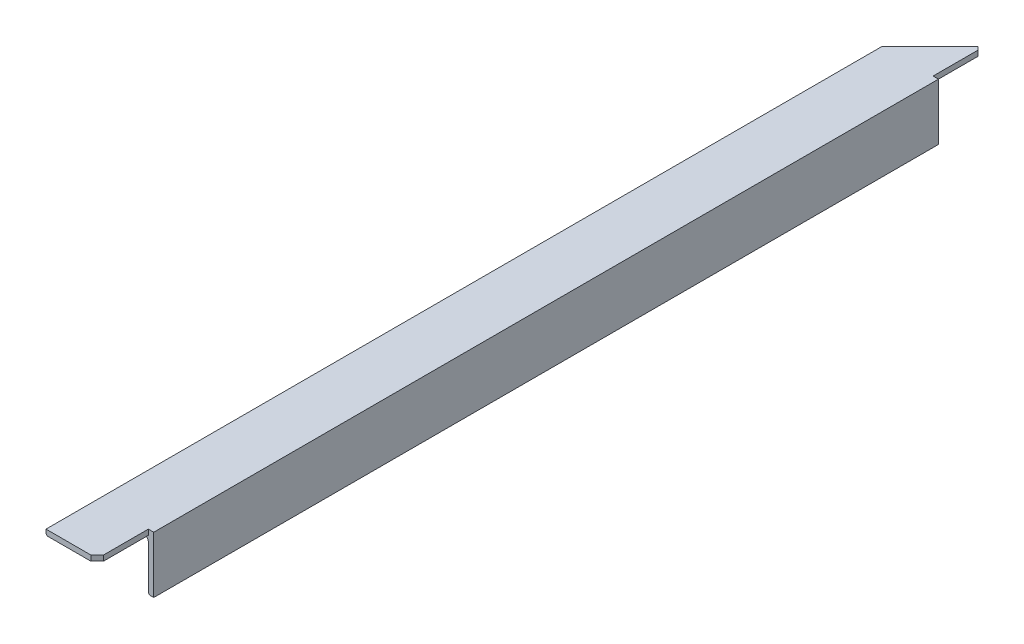
ISO-10303-21;
HEADER;
FILE_DESCRIPTION(('STEP AP214'),'2;1');
FILE_NAME('part.step','',(''),(''),'','','');
FILE_SCHEMA(('AUTOMOTIVE_DESIGN { 1 0 10303 214 1 1 1 1 }'));
ENDSEC;
DATA;
#1=APPLICATION_CONTEXT('core data for automotive mechanical design processes');
#2=APPLICATION_PROTOCOL_DEFINITION('international standard','automotive_design',2000,#1);
#3=PRODUCT_CONTEXT('',#1,'mechanical');
#4=PRODUCT('Part','Part','',(#3));
#5=PRODUCT_RELATED_PRODUCT_CATEGORY('part','',(#4));
#6=PRODUCT_DEFINITION_FORMATION('','',#4);
#7=PRODUCT_DEFINITION_CONTEXT('part definition',#1,'design');
#8=PRODUCT_DEFINITION('design','',#6,#7);
#9=PRODUCT_DEFINITION_SHAPE('','',#8);
#10=(LENGTH_UNIT() NAMED_UNIT(*) SI_UNIT(.MILLI.,.METRE.));
#11=(NAMED_UNIT(*) PLANE_ANGLE_UNIT() SI_UNIT($,.RADIAN.));
#12=(NAMED_UNIT(*) SI_UNIT($,.STERADIAN.) SOLID_ANGLE_UNIT());
#13=UNCERTAINTY_MEASURE_WITH_UNIT(LENGTH_MEASURE(1.E-05),#10,'distance_accuracy_value','');
#14=(GEOMETRIC_REPRESENTATION_CONTEXT(3) GLOBAL_UNCERTAINTY_ASSIGNED_CONTEXT((#13)) GLOBAL_UNIT_ASSIGNED_CONTEXT((#10,
#11,#12)) REPRESENTATION_CONTEXT('',''));
#15=CARTESIAN_POINT('',(0.,0.,0.));
#16=DIRECTION('',(0.,0.,1.));
#17=DIRECTION('',(1.,0.,0.));
#18=AXIS2_PLACEMENT_3D('',#15,#16,#17);
#19=CARTESIAN_POINT('',(737.,1087.,500.));
#20=DIRECTION('',(0.,0.,-1.));
#21=DIRECTION('',(-1.,0.,0.));
#22=AXIS2_PLACEMENT_3D('',#19,#20,#21);
#23=CYLINDRICAL_SURFACE('',#22,7.00000000000001);
#24=CARTESIAN_POINT('',(737.,1087.,437.));
#25=DIRECTION('',(0.,0.,1.));
#26=DIRECTION('',(1.,0.,0.));
#27=AXIS2_PLACEMENT_3D('',#24,#25,#26);
#28=CIRCLE('',#27,7.00000000000001);
#29=CARTESIAN_POINT('',(737.,1094.,437.));
#30=VERTEX_POINT('',#29);
#31=CARTESIAN_POINT('',(744.000000000001,1087.,437.));
#32=VERTEX_POINT('',#31);
#33=EDGE_CURVE('E160',#30,#32,#28,.F.);
#34=ORIENTED_EDGE('',*,*,#33,.F.);
#35=DIRECTION('',(0.,0.,-1.));
#36=VECTOR('',#35,1.);
#37=CARTESIAN_POINT('',(737.,1094.,500.));
#38=LINE('',#37,#36);
#39=CARTESIAN_POINT('',(737.,1094.,-437.));
#40=VERTEX_POINT('',#39);
#41=EDGE_CURVE('E154',#30,#40,#38,.T.);
#42=ORIENTED_EDGE('',*,*,#41,.T.);
#43=CARTESIAN_POINT('',(737.,1087.,-437.));
#44=DIRECTION('',(0.,0.,1.));
#45=DIRECTION('',(1.,0.,0.));
#46=AXIS2_PLACEMENT_3D('',#43,#44,#45);
#47=CIRCLE('',#46,7.00000000000001);
#48=CARTESIAN_POINT('',(744.,1087.,-437.));
#49=VERTEX_POINT('',#48);
#50=EDGE_CURVE('E449',#49,#40,#47,.T.);
#51=ORIENTED_EDGE('',*,*,#50,.F.);
#52=DIRECTION('',(0.,0.,-1.));
#53=VECTOR('',#52,1.);
#54=CARTESIAN_POINT('',(744.,1087.,500.));
#55=LINE('',#54,#53);
#56=EDGE_CURVE('E172',#32,#49,#55,.T.);
#57=ORIENTED_EDGE('',*,*,#56,.F.);
#58=EDGE_LOOP('',(#34,#42,#51,#57));
#59=FACE_BOUND('',#58,.T.);
#60=ADVANCED_FACE('F35',(#59),#23,.F.);
#61=CARTESIAN_POINT('',(750.,1100.,-500.));
#62=DIRECTION('',(-0.707106781186547,0.,-0.707106781186548));
#63=DIRECTION('',(-0.707106781186548,0.,0.707106781186547));
#64=AXIS2_PLACEMENT_3D('',#61,#62,#63);
#65=PLANE('',#64);
#66=DIRECTION('',(0.,1.,0.));
#67=VECTOR('',#66,1.);
#68=CARTESIAN_POINT('',(740.5,1100.,-490.5));
#69=LINE('',#68,#67);
#70=CARTESIAN_POINT('',(740.5,1094.,-490.5));
#71=VERTEX_POINT('',#70);
#72=CARTESIAN_POINT('',(740.5,1100.,-490.5));
#73=VERTEX_POINT('',#72);
#74=EDGE_CURVE('E11',#71,#73,#69,.T.);
#75=ORIENTED_EDGE('',*,*,#74,.F.);
#76=DIRECTION('',(-0.707106781186548,0.,0.707106781186547));
#77=VECTOR('',#76,1.);
#78=CARTESIAN_POINT('',(243.5,1094.,6.49999999999962));
#79=LINE('',#78,#77);
#80=CARTESIAN_POINT('',(689.3,1094.,-439.3));
#81=VERTEX_POINT('',#80);
#82=EDGE_CURVE('E50',#71,#81,#79,.T.);
#83=ORIENTED_EDGE('',*,*,#82,.T.);
#84=CARTESIAN_POINT('',(689.3,1096.3,-439.3));
#85=DIRECTION('',(-0.707106781186547,0.,-0.707106781186548));
#86=DIRECTION('',(0.707106781186548,0.,-0.707106781186547));
#87=AXIS2_PLACEMENT_3D('',#84,#85,#86);
#88=ELLIPSE('',#87,3.25269119345807,2.29999999999997);
#89=CARTESIAN_POINT('',(687.,1096.3,-437.));
#90=VERTEX_POINT('',#89);
#91=EDGE_CURVE('E218',#81,#90,#88,.T.);
#92=ORIENTED_EDGE('',*,*,#91,.T.);
#93=DIRECTION('',(0.,1.,0.));
#94=VECTOR('',#93,1.);
#95=CARTESIAN_POINT('',(687.,1096.3,-437.));
#96=LINE('',#95,#94);
#97=CARTESIAN_POINT('',(687.,1100.,-437.));
#98=VERTEX_POINT('',#97);
#99=EDGE_CURVE('E236',#90,#98,#96,.T.);
#100=ORIENTED_EDGE('',*,*,#99,.T.);
#101=DIRECTION('',(0.707106781186548,0.,-0.707106781186547));
#102=VECTOR('',#101,1.);
#103=CARTESIAN_POINT('',(250.,1100.,-3.33066907387547E-13));
#104=LINE('',#103,#102);
#105=EDGE_CURVE('E43',#98,#73,#104,.T.);
#106=ORIENTED_EDGE('',*,*,#105,.T.);
#107=EDGE_LOOP('',(#75,#83,#92,#100,#106));
#108=FACE_BOUND('',#107,.T.);
#109=ADVANCED_FACE('F37',(#108),#65,.T.);
#110=CARTESIAN_POINT('',(744.,1100.,-439.3));
#111=DIRECTION('',(1.,0.,0.));
#112=DIRECTION('',(0.,0.,-1.));
#113=AXIS2_PLACEMENT_3D('',#110,#111,#112);
#114=PLANE('',#113);
#115=DIRECTION('',(0.,-1.,0.));
#116=VECTOR('',#115,1.);
#117=CARTESIAN_POINT('',(744.,1100.,-437.));
#118=LINE('',#117,#116);
#119=CARTESIAN_POINT('',(744.,1100.,-437.));
#120=VERTEX_POINT('',#119);
#121=CARTESIAN_POINT('',(744.,1094.,-437.));
#122=VERTEX_POINT('',#121);
#123=EDGE_CURVE('E252',#120,#122,#118,.T.);
#124=ORIENTED_EDGE('',*,*,#123,.T.);
#125=DIRECTION('',(0.,0.,1.));
#126=VECTOR('',#125,1.);
#127=CARTESIAN_POINT('',(743.999999999999,1094.,-510.001000000016));
#128=LINE('',#127,#126);
#129=CARTESIAN_POINT('',(744.,1094.,-487.));
#130=VERTEX_POINT('',#129);
#131=EDGE_CURVE('E446',#130,#122,#128,.T.);
#132=ORIENTED_EDGE('',*,*,#131,.F.);
#133=DIRECTION('',(0.,-1.,0.));
#134=VECTOR('',#133,1.);
#135=CARTESIAN_POINT('',(744.,1100.,-487.));
#136=LINE('',#135,#134);
#137=CARTESIAN_POINT('',(744.,1100.,-487.));
#138=VERTEX_POINT('',#137);
#139=EDGE_CURVE('E255',#138,#130,#136,.T.);
#140=ORIENTED_EDGE('',*,*,#139,.F.);
#141=DIRECTION('',(0.,0.,1.));
#142=VECTOR('',#141,1.);
#143=CARTESIAN_POINT('',(744.000000000008,1100.,500.));
#144=LINE('',#143,#142);
#145=EDGE_CURVE('E200',#138,#120,#144,.T.);
#146=ORIENTED_EDGE('',*,*,#145,.T.);
#147=EDGE_LOOP('',(#124,#132,#140,#146));
#148=FACE_BOUND('',#147,.T.);
#149=ADVANCED_FACE('F308',(#148),#114,.T.);
#150=CARTESIAN_POINT('',(744.,1100.,-487.));
#151=DIRECTION('',(-0.707106781186547,0.,0.707106781186548));
#152=DIRECTION('',(0.707106781186548,0.,0.707106781186547));
#153=AXIS2_PLACEMENT_3D('',#150,#151,#152);
#154=PLANE('',#153);
#155=DIRECTION('',(-0.707106781186548,0.,-0.707106781186547));
#156=VECTOR('',#155,1.);
#157=CARTESIAN_POINT('',(732.499499999992,1094.,-498.500500000008));
#158=LINE('',#157,#156);
#159=EDGE_CURVE('E256',#130,#71,#158,.T.);
#160=ORIENTED_EDGE('',*,*,#159,.T.);
#161=ORIENTED_EDGE('',*,*,#74,.T.);
#162=DIRECTION('',(-0.707106781186548,0.,-0.707106781186547));
#163=VECTOR('',#162,1.);
#164=CARTESIAN_POINT('',(1240.5,1100.,9.49999999999967));
#165=LINE('',#164,#163);
#166=EDGE_CURVE('E262',#138,#73,#165,.T.);
#167=ORIENTED_EDGE('',*,*,#166,.F.);
#168=ORIENTED_EDGE('',*,*,#139,.T.);
#169=EDGE_LOOP('',(#160,#161,#167,#168));
#170=FACE_BOUND('',#169,.T.);
#171=ADVANCED_FACE('F291',(#170),#154,.F.);
#172=CARTESIAN_POINT('',(750.000000000001,1037.,500.));
#173=DIRECTION('',(0.,1.,0.));
#174=DIRECTION('',(-1.,0.,0.));
#175=AXIS2_PLACEMENT_3D('',#172,#173,#174);
#176=PLANE('',#175);
#177=DIRECTION('',(-1.,0.,0.));
#178=VECTOR('',#177,1.);
#179=CARTESIAN_POINT('',(749.99999999999,1037.,-437.));
#180=LINE('',#179,#178);
#181=CARTESIAN_POINT('',(750.,1037.,-437.));
#182=VERTEX_POINT('',#181);
#183=CARTESIAN_POINT('',(746.300000000001,1037.,-437.));
#184=VERTEX_POINT('',#183);
#185=EDGE_CURVE('E212',#182,#184,#180,.T.);
#186=ORIENTED_EDGE('',*,*,#185,.F.);
#187=DIRECTION('',(0.,0.,-1.));
#188=VECTOR('',#187,1.);
#189=CARTESIAN_POINT('',(750.000000000001,1037.,500.));
#190=LINE('',#189,#188);
#191=CARTESIAN_POINT('',(750.000000000001,1037.,437.));
#192=VERTEX_POINT('',#191);
#193=EDGE_CURVE('E196',#192,#182,#190,.T.);
#194=ORIENTED_EDGE('',*,*,#193,.F.);
#195=DIRECTION('',(1.,0.,0.));
#196=VECTOR('',#195,1.);
#197=CARTESIAN_POINT('',(750.000000000001,1037.,437.));
#198=LINE('',#197,#196);
#199=CARTESIAN_POINT('',(746.300000000001,1037.,437.));
#200=VERTEX_POINT('',#199);
#201=EDGE_CURVE('E217',#200,#192,#198,.T.);
#202=ORIENTED_EDGE('',*,*,#201,.F.);
#203=DIRECTION('',(0.,0.,-1.));
#204=VECTOR('',#203,1.);
#205=CARTESIAN_POINT('',(746.300000000001,1037.,500.));
#206=LINE('',#205,#204);
#207=EDGE_CURVE('E198',#200,#184,#206,.T.);
#208=ORIENTED_EDGE('',*,*,#207,.T.);
#209=EDGE_LOOP('',(#186,#194,#202,#208));
#210=FACE_BOUND('',#209,.T.);
#211=ADVANCED_FACE('F268',(#210),#176,.F.);
#212=CARTESIAN_POINT('',(750.000000000001,1037.,500.));
#213=DIRECTION('',(-1.,0.,0.));
#214=DIRECTION('',(0.,-1.,0.));
#215=AXIS2_PLACEMENT_3D('',#212,#213,#214);
#216=PLANE('',#215);
#217=DIRECTION('',(0.,-1.,0.));
#218=VECTOR('',#217,1.);
#219=CARTESIAN_POINT('',(750.,1100.,-437.));
#220=LINE('',#219,#218);
#221=CARTESIAN_POINT('',(750.,1100.,-437.));
#222=VERTEX_POINT('',#221);
#223=EDGE_CURVE('E253',#222,#182,#220,.T.);
#224=ORIENTED_EDGE('',*,*,#223,.F.);
#225=DIRECTION('',(0.,0.,-1.));
#226=VECTOR('',#225,1.);
#227=CARTESIAN_POINT('',(750.,1100.,500.));
#228=LINE('',#227,#226);
#229=CARTESIAN_POINT('',(750.000000000001,1100.,437.));
#230=VERTEX_POINT('',#229);
#231=EDGE_CURVE('E192',#230,#222,#228,.T.);
#232=ORIENTED_EDGE('',*,*,#231,.F.);
#233=DIRECTION('',(0.,1.,0.));
#234=VECTOR('',#233,1.);
#235=CARTESIAN_POINT('',(750.,0.,437.));
#236=LINE('',#235,#234);
#237=EDGE_CURVE('E59',#192,#230,#236,.T.);
#238=ORIENTED_EDGE('',*,*,#237,.F.);
#239=ORIENTED_EDGE('',*,*,#193,.T.);
#240=EDGE_LOOP('',(#224,#232,#238,#239));
#241=FACE_BOUND('',#240,.T.);
#242=ADVANCED_FACE('F270',(#241),#216,.F.);
#243=CARTESIAN_POINT('',(744.000000000001,1039.3,500.));
#244=DIRECTION('',(1.,0.,0.));
#245=DIRECTION('',(0.,1.,0.));
#246=AXIS2_PLACEMENT_3D('',#243,#244,#245);
#247=PLANE('',#246);
#248=CARTESIAN_POINT('',(744.,1039.3,-437.));
#249=VERTEX_POINT('',#248);
#250=EDGE_CURVE('E249',#49,#249,#118,.T.);
#251=ORIENTED_EDGE('',*,*,#250,.T.);
#252=DIRECTION('',(0.,0.,-1.));
#253=VECTOR('',#252,1.);
#254=CARTESIAN_POINT('',(744.000000000001,1039.3,500.));
#255=LINE('',#254,#253);
#256=CARTESIAN_POINT('',(744.000000000001,1039.3,437.));
#257=VERTEX_POINT('',#256);
#258=EDGE_CURVE('E178',#257,#249,#255,.T.);
#259=ORIENTED_EDGE('',*,*,#258,.F.);
#260=DIRECTION('',(0.,1.,0.));
#261=VECTOR('',#260,1.);
#262=CARTESIAN_POINT('',(744.,0.,437.));
#263=LINE('',#262,#261);
#264=EDGE_CURVE('E88',#257,#32,#263,.T.);
#265=ORIENTED_EDGE('',*,*,#264,.T.);
#266=ORIENTED_EDGE('',*,*,#56,.T.);
#267=EDGE_LOOP('',(#251,#259,#265,#266));
#268=FACE_BOUND('',#267,.T.);
#269=ADVANCED_FACE('F247',(#268),#247,.F.);
#270=CARTESIAN_POINT('',(746.300000000001,1039.3,500.));
#271=DIRECTION('',(0.,0.,-1.));
#272=DIRECTION('',(-1.,0.,0.));
#273=AXIS2_PLACEMENT_3D('',#270,#271,#272);
#274=CYLINDRICAL_SURFACE('',#273,2.3);
#275=CARTESIAN_POINT('',(746.3,1039.3,-437.));
#276=DIRECTION('',(0.,0.,-1.));
#277=DIRECTION('',(-1.,0.,0.));
#278=AXIS2_PLACEMENT_3D('',#275,#276,#277);
#279=CIRCLE('',#278,2.3);
#280=EDGE_CURVE('E245',#184,#249,#279,.T.);
#281=ORIENTED_EDGE('',*,*,#280,.F.);
#282=ORIENTED_EDGE('',*,*,#207,.F.);
#283=CARTESIAN_POINT('',(746.300000000001,1039.3,437.));
#284=DIRECTION('',(0.,0.,1.));
#285=DIRECTION('',(1.,0.,0.));
#286=AXIS2_PLACEMENT_3D('',#283,#284,#285);
#287=CIRCLE('',#286,2.3);
#288=EDGE_CURVE('E167',#257,#200,#287,.T.);
#289=ORIENTED_EDGE('',*,*,#288,.F.);
#290=ORIENTED_EDGE('',*,*,#258,.T.);
#291=EDGE_LOOP('',(#281,#282,#289,#290));
#292=FACE_BOUND('',#291,.T.);
#293=ADVANCED_FACE('F244',(#292),#274,.T.);
#294=CARTESIAN_POINT('',(750.,1100.,500.));
#295=DIRECTION('',(0.,-1.,0.));
#296=DIRECTION('',(1.,0.,0.));
#297=AXIS2_PLACEMENT_3D('',#294,#295,#296);
#298=PLANE('',#297);
#299=ORIENTED_EDGE('',*,*,#145,.F.);
#300=ORIENTED_EDGE('',*,*,#166,.T.);
#301=ORIENTED_EDGE('',*,*,#105,.F.);
#302=DIRECTION('',(0.,0.,-1.));
#303=VECTOR('',#302,1.);
#304=CARTESIAN_POINT('',(687.,1100.,500.));
#305=LINE('',#304,#303);
#306=CARTESIAN_POINT('',(687.,1100.,494.));
#307=VERTEX_POINT('',#306);
#308=EDGE_CURVE('E185',#307,#98,#305,.T.);
#309=ORIENTED_EDGE('',*,*,#308,.F.);
#310=DIRECTION('',(-1.,0.,0.));
#311=VECTOR('',#310,1.);
#312=CARTESIAN_POINT('',(750.,1100.,494.));
#313=LINE('',#312,#311);
#314=CARTESIAN_POINT('',(737.,1100.,494.));
#315=VERTEX_POINT('',#314);
#316=EDGE_CURVE('E232',#315,#307,#313,.T.);
#317=ORIENTED_EDGE('',*,*,#316,.F.);
#318=DIRECTION('',(0.707106781186548,0.,-0.707106781186547));
#319=VECTOR('',#318,1.);
#320=CARTESIAN_POINT('',(740.5,1100.,490.5));
#321=LINE('',#320,#319);
#322=CARTESIAN_POINT('',(744.,1100.,487.));
#323=VERTEX_POINT('',#322);
#324=EDGE_CURVE('E195',#315,#323,#321,.T.);
#325=ORIENTED_EDGE('',*,*,#324,.T.);
#326=DIRECTION('',(0.,0.,1.));
#327=VECTOR('',#326,1.);
#328=CARTESIAN_POINT('',(744.,1100.,500.));
#329=LINE('',#328,#327);
#330=CARTESIAN_POINT('',(744.000000000001,1100.,437.));
#331=VERTEX_POINT('',#330);
#332=EDGE_CURVE('E165',#331,#323,#329,.T.);
#333=ORIENTED_EDGE('',*,*,#332,.F.);
#334=DIRECTION('',(-1.,0.,0.));
#335=VECTOR('',#334,1.);
#336=CARTESIAN_POINT('',(750.000000000001,1100.,437.));
#337=LINE('',#336,#335);
#338=EDGE_CURVE('E163',#230,#331,#337,.T.);
#339=ORIENTED_EDGE('',*,*,#338,.F.);
#340=ORIENTED_EDGE('',*,*,#231,.T.);
#341=DIRECTION('',(1.,0.,0.));
#342=VECTOR('',#341,1.);
#343=CARTESIAN_POINT('',(749.999999999989,1100.,-437.));
#344=LINE('',#343,#342);
#345=EDGE_CURVE('E205',#120,#222,#344,.T.);
#346=ORIENTED_EDGE('',*,*,#345,.F.);
#347=EDGE_LOOP('',(#299,#300,#301,#309,#317,#325,#333,#339,#340,#346));
#348=FACE_BOUND('',#347,.T.);
#349=ADVANCED_FACE('F274',(#348),#298,.F.);
#350=CARTESIAN_POINT('',(687.,1096.3,500.));
#351=DIRECTION('',(1.,0.,0.));
#352=DIRECTION('',(0.,1.,0.));
#353=AXIS2_PLACEMENT_3D('',#350,#351,#352);
#354=PLANE('',#353);
#355=ORIENTED_EDGE('',*,*,#99,.F.);
#356=DIRECTION('',(0.,0.,-1.));
#357=VECTOR('',#356,1.);
#358=CARTESIAN_POINT('',(687.,1096.3,500.));
#359=LINE('',#358,#357);
#360=CARTESIAN_POINT('',(687.,1096.3,494.));
#361=VERTEX_POINT('',#360);
#362=EDGE_CURVE('E180',#361,#90,#359,.T.);
#363=ORIENTED_EDGE('',*,*,#362,.F.);
#364=DIRECTION('',(0.,1.,0.));
#365=VECTOR('',#364,1.);
#366=CARTESIAN_POINT('',(687.,0.,494.));
#367=LINE('',#366,#365);
#368=EDGE_CURVE('E191',#361,#307,#367,.T.);
#369=ORIENTED_EDGE('',*,*,#368,.T.);
#370=ORIENTED_EDGE('',*,*,#308,.T.);
#371=EDGE_LOOP('',(#355,#363,#369,#370));
#372=FACE_BOUND('',#371,.T.);
#373=ADVANCED_FACE('F293',(#372),#354,.F.);
#374=CARTESIAN_POINT('',(689.3,1096.3,500.));
#375=DIRECTION('',(0.,0.,-1.));
#376=DIRECTION('',(-1.,0.,0.));
#377=AXIS2_PLACEMENT_3D('',#374,#375,#376);
#378=CYLINDRICAL_SURFACE('',#377,2.29999999999997);
#379=ORIENTED_EDGE('',*,*,#91,.F.);
#380=DIRECTION('',(0.,0.,-1.));
#381=VECTOR('',#380,1.);
#382=CARTESIAN_POINT('',(689.3,1094.,500.));
#383=LINE('',#382,#381);
#384=CARTESIAN_POINT('',(689.3,1094.,494.));
#385=VERTEX_POINT('',#384);
#386=EDGE_CURVE('E173',#385,#81,#383,.T.);
#387=ORIENTED_EDGE('',*,*,#386,.F.);
#388=CARTESIAN_POINT('',(689.3,1096.3,494.));
#389=DIRECTION('',(0.,0.,1.));
#390=DIRECTION('',(1.,0.,0.));
#391=AXIS2_PLACEMENT_3D('',#388,#389,#390);
#392=CIRCLE('',#391,2.29999999999997);
#393=EDGE_CURVE('E230',#361,#385,#392,.T.);
#394=ORIENTED_EDGE('',*,*,#393,.F.);
#395=ORIENTED_EDGE('',*,*,#362,.T.);
#396=EDGE_LOOP('',(#379,#387,#394,#395));
#397=FACE_BOUND('',#396,.T.);
#398=ADVANCED_FACE('F286',(#397),#378,.T.);
#399=CARTESIAN_POINT('',(737.,1094.,500.));
#400=DIRECTION('',(0.,1.,0.));
#401=DIRECTION('',(-1.,0.,0.));
#402=AXIS2_PLACEMENT_3D('',#399,#400,#401);
#403=PLANE('',#402);
#404=ORIENTED_EDGE('',*,*,#82,.F.);
#405=ORIENTED_EDGE('',*,*,#159,.F.);
#406=ORIENTED_EDGE('',*,*,#131,.T.);
#407=DIRECTION('',(1.,0.,0.));
#408=VECTOR('',#407,1.);
#409=CARTESIAN_POINT('',(744.,1094.,-437.));
#410=LINE('',#409,#408);
#411=EDGE_CURVE('E448',#40,#122,#410,.T.);
#412=ORIENTED_EDGE('',*,*,#411,.F.);
#413=ORIENTED_EDGE('',*,*,#41,.F.);
#414=DIRECTION('',(-1.,0.,0.));
#415=VECTOR('',#414,1.);
#416=CARTESIAN_POINT('',(744.,1094.,437.));
#417=LINE('',#416,#415);
#418=CARTESIAN_POINT('',(744.,1094.,437.));
#419=VERTEX_POINT('',#418);
#420=EDGE_CURVE('E149',#419,#30,#417,.T.);
#421=ORIENTED_EDGE('',*,*,#420,.F.);
#422=DIRECTION('',(0.,0.,1.));
#423=VECTOR('',#422,1.);
#424=CARTESIAN_POINT('',(744.,1094.,437.));
#425=LINE('',#424,#423);
#426=CARTESIAN_POINT('',(744.,1094.,487.));
#427=VERTEX_POINT('',#426);
#428=EDGE_CURVE('E151',#419,#427,#425,.T.);
#429=ORIENTED_EDGE('',*,*,#428,.T.);
#430=DIRECTION('',(0.707106781186548,0.,-0.707106781186547));
#431=VECTOR('',#430,1.);
#432=CARTESIAN_POINT('',(744.,1094.,487.));
#433=LINE('',#432,#431);
#434=CARTESIAN_POINT('',(737.,1094.,493.999999999995));
#435=VERTEX_POINT('',#434);
#436=EDGE_CURVE('E284',#435,#427,#433,.T.);
#437=ORIENTED_EDGE('',*,*,#436,.F.);
#438=DIRECTION('',(1.,0.,0.));
#439=VECTOR('',#438,1.);
#440=CARTESIAN_POINT('',(737.,1094.,494.));
#441=LINE('',#440,#439);
#442=EDGE_CURVE('E227',#385,#435,#441,.T.);
#443=ORIENTED_EDGE('',*,*,#442,.F.);
#444=ORIENTED_EDGE('',*,*,#386,.T.);
#445=EDGE_LOOP('',(#404,#405,#406,#412,#413,#421,#429,#437,#443,#444));
#446=FACE_BOUND('',#445,.T.);
#447=ADVANCED_FACE('F150',(#446),#403,.F.);
#448=CARTESIAN_POINT('',(737.,0.,494.));
#449=DIRECTION('',(0.,0.,1.));
#450=DIRECTION('',(1.,0.,0.));
#451=AXIS2_PLACEMENT_3D('',#448,#449,#450);
#452=PLANE('',#451);
#453=ORIENTED_EDGE('',*,*,#316,.T.);
#454=ORIENTED_EDGE('',*,*,#368,.F.);
#455=ORIENTED_EDGE('',*,*,#393,.T.);
#456=ORIENTED_EDGE('',*,*,#442,.T.);
#457=DIRECTION('',(0.,1.,0.));
#458=VECTOR('',#457,1.);
#459=CARTESIAN_POINT('',(737.,0.,494.));
#460=LINE('',#459,#458);
#461=EDGE_CURVE('E223',#435,#315,#460,.T.);
#462=ORIENTED_EDGE('',*,*,#461,.T.);
#463=EDGE_LOOP('',(#453,#454,#455,#456,#462));
#464=FACE_BOUND('',#463,.T.);
#465=ADVANCED_FACE('F282',(#464),#452,.T.);
#466=CARTESIAN_POINT('',(744.,0.,487.));
#467=DIRECTION('',(-0.707106781186547,0.,-0.707106781186548));
#468=DIRECTION('',(-0.707106781186548,0.,0.707106781186547));
#469=AXIS2_PLACEMENT_3D('',#466,#467,#468);
#470=PLANE('',#469);
#471=ORIENTED_EDGE('',*,*,#461,.F.);
#472=ORIENTED_EDGE('',*,*,#436,.T.);
#473=DIRECTION('',(0.,1.,0.));
#474=VECTOR('',#473,1.);
#475=CARTESIAN_POINT('',(744.,0.,487.));
#476=LINE('',#475,#474);
#477=EDGE_CURVE('E159',#427,#323,#476,.T.);
#478=ORIENTED_EDGE('',*,*,#477,.T.);
#479=ORIENTED_EDGE('',*,*,#324,.F.);
#480=EDGE_LOOP('',(#471,#472,#478,#479));
#481=FACE_BOUND('',#480,.T.);
#482=ADVANCED_FACE('F280',(#481),#470,.F.);
#483=CARTESIAN_POINT('',(744.,0.,439.3));
#484=DIRECTION('',(1.,0.,0.));
#485=DIRECTION('',(0.,0.,-1.));
#486=AXIS2_PLACEMENT_3D('',#483,#484,#485);
#487=PLANE('',#486);
#488=ORIENTED_EDGE('',*,*,#428,.F.);
#489=EDGE_CURVE('E95',#419,#331,#263,.T.);
#490=ORIENTED_EDGE('',*,*,#489,.T.);
#491=ORIENTED_EDGE('',*,*,#332,.T.);
#492=ORIENTED_EDGE('',*,*,#477,.F.);
#493=EDGE_LOOP('',(#488,#490,#491,#492));
#494=FACE_BOUND('',#493,.T.);
#495=ADVANCED_FACE('F158',(#494),#487,.T.);
#496=CARTESIAN_POINT('',(750.,0.,437.));
#497=DIRECTION('',(0.,0.,1.));
#498=DIRECTION('',(1.,0.,0.));
#499=AXIS2_PLACEMENT_3D('',#496,#497,#498);
#500=PLANE('',#499);
#501=ORIENTED_EDGE('',*,*,#338,.T.);
#502=ORIENTED_EDGE('',*,*,#489,.F.);
#503=ORIENTED_EDGE('',*,*,#420,.T.);
#504=ORIENTED_EDGE('',*,*,#33,.T.);
#505=ORIENTED_EDGE('',*,*,#264,.F.);
#506=ORIENTED_EDGE('',*,*,#288,.T.);
#507=ORIENTED_EDGE('',*,*,#201,.T.);
#508=ORIENTED_EDGE('',*,*,#237,.T.);
#509=EDGE_LOOP('',(#501,#502,#503,#504,#505,#506,#507,#508));
#510=FACE_BOUND('',#509,.T.);
#511=ADVANCED_FACE('F162',(#510),#500,.T.);
#512=CARTESIAN_POINT('',(750.,1100.,-437.));
#513=DIRECTION('',(0.,0.,-1.));
#514=DIRECTION('',(-1.,0.,0.));
#515=AXIS2_PLACEMENT_3D('',#512,#513,#514);
#516=PLANE('',#515);
#517=ORIENTED_EDGE('',*,*,#345,.T.);
#518=ORIENTED_EDGE('',*,*,#223,.T.);
#519=ORIENTED_EDGE('',*,*,#185,.T.);
#520=ORIENTED_EDGE('',*,*,#280,.T.);
#521=ORIENTED_EDGE('',*,*,#250,.F.);
#522=ORIENTED_EDGE('',*,*,#50,.T.);
#523=ORIENTED_EDGE('',*,*,#411,.T.);
#524=ORIENTED_EDGE('',*,*,#123,.F.);
#525=EDGE_LOOP('',(#517,#518,#519,#520,#521,#522,#523,#524));
#526=FACE_BOUND('',#525,.T.);
#527=ADVANCED_FACE('F265',(#526),#516,.T.);
#528=CLOSED_SHELL('',(#60,#109,#149,#171,#211,#242,#269,#293,#349,#373,#398,#447,#465,#482,#495,
#511,#527));
#529=MANIFOLD_SOLID_BREP('B2',#528);
#530=ADVANCED_BREP_SHAPE_REPRESENTATION('',(#18,#529),#14);
#531=SHAPE_DEFINITION_REPRESENTATION(#9,#530);
ENDSEC;
END-ISO-10303-21;
